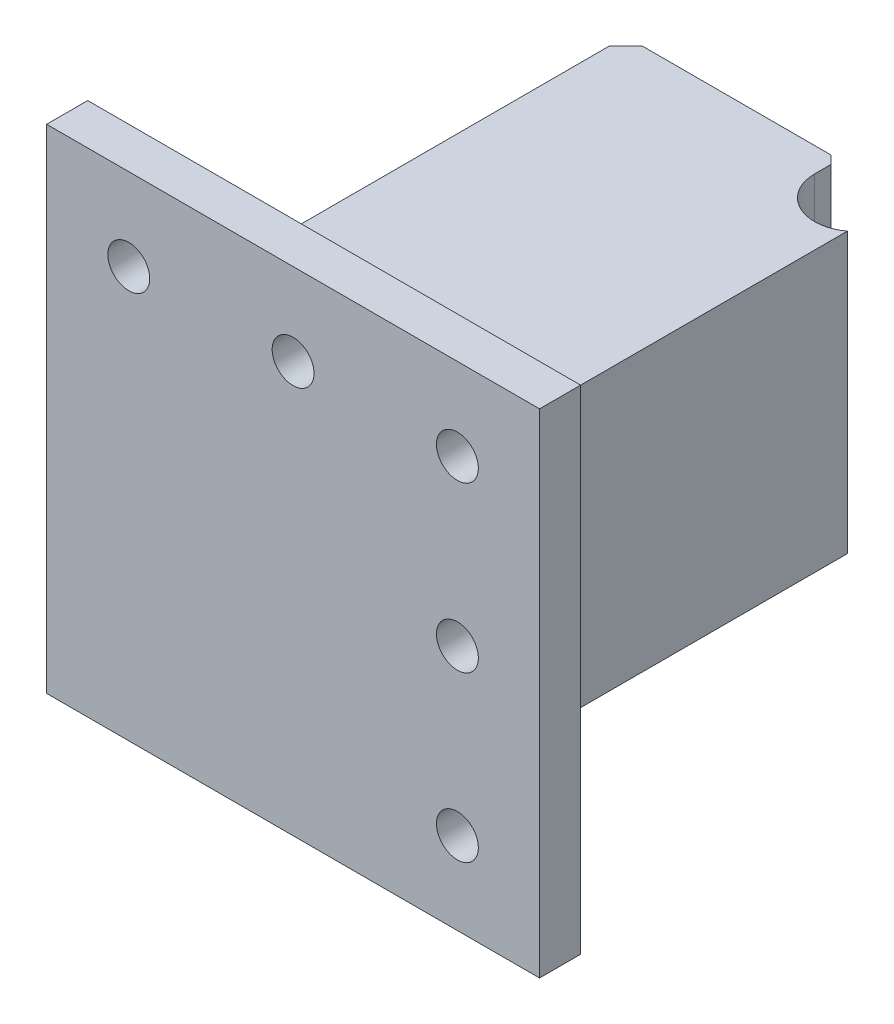
ISO-10303-21;
HEADER;
FILE_DESCRIPTION(('STEP AP214'),'2;1');
FILE_NAME('part.step','',(''),(''),'','','');
FILE_SCHEMA(('AUTOMOTIVE_DESIGN { 1 0 10303 214 1 1 1 1 }'));
ENDSEC;
DATA;
#1=APPLICATION_CONTEXT('core data for automotive mechanical design processes');
#2=APPLICATION_PROTOCOL_DEFINITION('international standard','automotive_design',2000,#1);
#3=PRODUCT_CONTEXT('',#1,'mechanical');
#4=PRODUCT('Part','Part','',(#3));
#5=PRODUCT_RELATED_PRODUCT_CATEGORY('part','',(#4));
#6=PRODUCT_DEFINITION_FORMATION('','',#4);
#7=PRODUCT_DEFINITION_CONTEXT('part definition',#1,'design');
#8=PRODUCT_DEFINITION('design','',#6,#7);
#9=PRODUCT_DEFINITION_SHAPE('','',#8);
#10=(LENGTH_UNIT() NAMED_UNIT(*) SI_UNIT(.MILLI.,.METRE.));
#11=(NAMED_UNIT(*) PLANE_ANGLE_UNIT() SI_UNIT($,.RADIAN.));
#12=(NAMED_UNIT(*) SI_UNIT($,.STERADIAN.) SOLID_ANGLE_UNIT());
#13=UNCERTAINTY_MEASURE_WITH_UNIT(LENGTH_MEASURE(1.E-05),#10,'distance_accuracy_value','');
#14=(GEOMETRIC_REPRESENTATION_CONTEXT(3) GLOBAL_UNCERTAINTY_ASSIGNED_CONTEXT((#13)) GLOBAL_UNIT_ASSIGNED_CONTEXT((#10,
#11,#12)) REPRESENTATION_CONTEXT('',''));
#15=CARTESIAN_POINT('',(0.,0.,0.));
#16=DIRECTION('',(0.,0.,1.));
#17=DIRECTION('',(1.,0.,0.));
#18=AXIS2_PLACEMENT_3D('',#15,#16,#17);
#19=CARTESIAN_POINT('',(0.,0.,5.));
#20=DIRECTION('',(0.,1.,0.));
#21=DIRECTION('',(0.,0.,1.));
#22=AXIS2_PLACEMENT_3D('',#19,#20,#21);
#23=PLANE('',#22);
#24=DIRECTION('',(0.,0.,-1.));
#25=VECTOR('',#24,1.);
#26=CARTESIAN_POINT('',(-60.,0.,5.));
#27=LINE('',#26,#25);
#28=CARTESIAN_POINT('',(-60.,0.,5.));
#29=VERTEX_POINT('',#28);
#30=CARTESIAN_POINT('',(-60.,0.,-63.5));
#31=VERTEX_POINT('',#30);
#32=EDGE_CURVE('E161',#29,#31,#27,.T.);
#33=ORIENTED_EDGE('',*,*,#32,.T.);
#34=DIRECTION('',(1.,0.,0.));
#35=VECTOR('',#34,1.);
#36=CARTESIAN_POINT('',(-34.0249999999993,0.,-63.5));
#37=LINE('',#36,#35);
#38=CARTESIAN_POINT('',(-34.0249999999993,0.,-63.5));
#39=VERTEX_POINT('',#38);
#40=EDGE_CURVE('E198',#31,#39,#37,.T.);
#41=ORIENTED_EDGE('',*,*,#40,.T.);
#42=DIRECTION('',(0.,0.,-1.));
#43=VECTOR('',#42,1.);
#44=CARTESIAN_POINT('',(-34.0249999999993,0.,0.));
#45=LINE('',#44,#43);
#46=CARTESIAN_POINT('',(-34.0249999999993,0.,-62.5000000000006));
#47=VERTEX_POINT('',#46);
#48=EDGE_CURVE('E136',#47,#39,#45,.T.);
#49=ORIENTED_EDGE('',*,*,#48,.F.);
#50=CARTESIAN_POINT('',(-28.9999999999993,0.,-62.5000000000006));
#51=DIRECTION('',(0.,-1.,0.));
#52=DIRECTION('',(0.,0.,-1.));
#53=AXIS2_PLACEMENT_3D('',#50,#51,#52);
#54=CIRCLE('',#53,5.025);
#55=CARTESIAN_POINT('',(-26.,0.,-58.4687936048871));
#56=VERTEX_POINT('',#55);
#57=EDGE_CURVE('E219',#56,#47,#54,.T.);
#58=ORIENTED_EDGE('',*,*,#57,.F.);
#59=DIRECTION('',(0.,0.,1.));
#60=VECTOR('',#59,1.);
#61=CARTESIAN_POINT('',(-26.,0.,-65.5));
#62=LINE('',#61,#60);
#63=CARTESIAN_POINT('',(-26.,0.,0.));
#64=VERTEX_POINT('',#63);
#65=EDGE_CURVE('E135',#56,#64,#62,.T.);
#66=ORIENTED_EDGE('',*,*,#65,.T.);
#67=DIRECTION('',(1.,0.,0.));
#68=VECTOR('',#67,1.);
#69=CARTESIAN_POINT('',(0.,0.,0.));
#70=LINE('',#69,#68);
#71=CARTESIAN_POINT('',(0.,0.,0.));
#72=VERTEX_POINT('',#71);
#73=EDGE_CURVE('E143',#64,#72,#70,.T.);
#74=ORIENTED_EDGE('',*,*,#73,.T.);
#75=DIRECTION('',(0.,0.,-1.));
#76=VECTOR('',#75,1.);
#77=CARTESIAN_POINT('',(0.,0.,5.));
#78=LINE('',#77,#76);
#79=CARTESIAN_POINT('',(0.,0.,5.));
#80=VERTEX_POINT('',#79);
#81=EDGE_CURVE('E169',#80,#72,#78,.T.);
#82=ORIENTED_EDGE('',*,*,#81,.F.);
#83=DIRECTION('',(1.,0.,0.));
#84=VECTOR('',#83,1.);
#85=CARTESIAN_POINT('',(0.,0.,5.));
#86=LINE('',#85,#84);
#87=EDGE_CURVE('E151',#29,#80,#86,.T.);
#88=ORIENTED_EDGE('',*,*,#87,.F.);
#89=EDGE_LOOP('',(#33,#41,#49,#58,#66,#74,#82,#88));
#90=FACE_BOUND('',#89,.T.);
#91=ADVANCED_FACE('F33',(#90),#23,.F.);
#92=CARTESIAN_POINT('',(0.,60.,5.));
#93=DIRECTION('',(-1.,0.,0.));
#94=DIRECTION('',(0.,0.,1.));
#95=AXIS2_PLACEMENT_3D('',#92,#93,#94);
#96=PLANE('',#95);
#97=DIRECTION('',(0.,1.,0.));
#98=VECTOR('',#97,1.);
#99=CARTESIAN_POINT('',(0.,60.,0.));
#100=LINE('',#99,#98);
#101=CARTESIAN_POINT('',(0.,60.,0.));
#102=VERTEX_POINT('',#101);
#103=EDGE_CURVE('E164',#72,#102,#100,.T.);
#104=ORIENTED_EDGE('',*,*,#103,.T.);
#105=DIRECTION('',(0.,0.,-1.));
#106=VECTOR('',#105,1.);
#107=CARTESIAN_POINT('',(0.,60.,5.));
#108=LINE('',#107,#106);
#109=CARTESIAN_POINT('',(0.,60.,5.));
#110=VERTEX_POINT('',#109);
#111=EDGE_CURVE('E182',#110,#102,#108,.T.);
#112=ORIENTED_EDGE('',*,*,#111,.F.);
#113=DIRECTION('',(0.,1.,0.));
#114=VECTOR('',#113,1.);
#115=CARTESIAN_POINT('',(0.,60.,5.));
#116=LINE('',#115,#114);
#117=EDGE_CURVE('E154',#80,#110,#116,.T.);
#118=ORIENTED_EDGE('',*,*,#117,.F.);
#119=ORIENTED_EDGE('',*,*,#81,.T.);
#120=EDGE_LOOP('',(#104,#112,#118,#119));
#121=FACE_BOUND('',#120,.T.);
#122=ADVANCED_FACE('F310',(#121),#96,.F.);
#123=CARTESIAN_POINT('',(0.,60.,5.));
#124=DIRECTION('',(0.,-1.,0.));
#125=DIRECTION('',(0.,0.,-1.));
#126=AXIS2_PLACEMENT_3D('',#123,#124,#125);
#127=PLANE('',#126);
#128=DIRECTION('',(-1.,0.,0.));
#129=VECTOR('',#128,1.);
#130=CARTESIAN_POINT('',(0.,60.,0.));
#131=LINE('',#130,#129);
#132=CARTESIAN_POINT('',(-60.,60.,0.));
#133=VERTEX_POINT('',#132);
#134=EDGE_CURVE('E174',#102,#133,#131,.T.);
#135=ORIENTED_EDGE('',*,*,#134,.T.);
#136=DIRECTION('',(0.,0.,-1.));
#137=VECTOR('',#136,1.);
#138=CARTESIAN_POINT('',(-60.,60.,5.));
#139=LINE('',#138,#137);
#140=CARTESIAN_POINT('',(-60.,60.,5.));
#141=VERTEX_POINT('',#140);
#142=EDGE_CURVE('E180',#141,#133,#139,.T.);
#143=ORIENTED_EDGE('',*,*,#142,.F.);
#144=DIRECTION('',(-1.,0.,0.));
#145=VECTOR('',#144,1.);
#146=CARTESIAN_POINT('',(0.,60.,5.));
#147=LINE('',#146,#145);
#148=EDGE_CURVE('E157',#110,#141,#147,.T.);
#149=ORIENTED_EDGE('',*,*,#148,.F.);
#150=ORIENTED_EDGE('',*,*,#111,.T.);
#151=EDGE_LOOP('',(#135,#143,#149,#150));
#152=FACE_BOUND('',#151,.T.);
#153=ADVANCED_FACE('F280',(#152),#127,.F.);
#154=CARTESIAN_POINT('',(-60.,0.,5.));
#155=DIRECTION('',(1.,0.,0.));
#156=DIRECTION('',(0.,0.,-1.));
#157=AXIS2_PLACEMENT_3D('',#154,#155,#156);
#158=PLANE('',#157);
#159=DIRECTION('',(0.,0.,1.));
#160=VECTOR('',#159,1.);
#161=CARTESIAN_POINT('',(-60.,34.,-65.5));
#162=LINE('',#161,#160);
#163=CARTESIAN_POINT('',(-60.,34.,-63.5));
#164=VERTEX_POINT('',#163);
#165=CARTESIAN_POINT('',(-60.,34.,0.));
#166=VERTEX_POINT('',#165);
#167=EDGE_CURVE('E141',#164,#166,#162,.T.);
#168=ORIENTED_EDGE('',*,*,#167,.F.);
#169=DIRECTION('',(0.,-1.,0.));
#170=VECTOR('',#169,1.);
#171=CARTESIAN_POINT('',(-60.,0.,-63.5));
#172=LINE('',#171,#170);
#173=EDGE_CURVE('E284',#164,#31,#172,.T.);
#174=ORIENTED_EDGE('',*,*,#173,.T.);
#175=ORIENTED_EDGE('',*,*,#32,.F.);
#176=DIRECTION('',(0.,-1.,0.));
#177=VECTOR('',#176,1.);
#178=CARTESIAN_POINT('',(-60.,0.,5.));
#179=LINE('',#178,#177);
#180=EDGE_CURVE('E159',#141,#29,#179,.T.);
#181=ORIENTED_EDGE('',*,*,#180,.F.);
#182=ORIENTED_EDGE('',*,*,#142,.T.);
#183=DIRECTION('',(0.,-1.,0.));
#184=VECTOR('',#183,1.);
#185=CARTESIAN_POINT('',(-60.,0.,0.));
#186=LINE('',#185,#184);
#187=EDGE_CURVE('E155',#133,#166,#186,.T.);
#188=ORIENTED_EDGE('',*,*,#187,.T.);
#189=EDGE_LOOP('',(#168,#174,#175,#181,#182,#188));
#190=FACE_BOUND('',#189,.T.);
#191=ADVANCED_FACE('F261',(#190),#158,.F.);
#192=CARTESIAN_POINT('',(0.,0.,5.));
#193=DIRECTION('',(0.,0.,-1.));
#194=DIRECTION('',(-1.,0.,0.));
#195=AXIS2_PLACEMENT_3D('',#192,#193,#194);
#196=PLANE('',#195);
#197=CARTESIAN_POINT('',(-9.99999999999999,9.99999999999995,5.));
#198=DIRECTION('',(0.,0.,1.));
#199=DIRECTION('',(1.,0.,0.));
#200=AXIS2_PLACEMENT_3D('',#197,#198,#199);
#201=CIRCLE('',#200,2.55000000000001);
#202=CARTESIAN_POINT('',(-7.44999999999998,9.99999999999995,5.));
#203=VERTEX_POINT('',#202);
#204=EDGE_CURVE('E246',#203,#203,#201,.T.);
#205=ORIENTED_EDGE('',*,*,#204,.F.);
#206=EDGE_LOOP('',(#205));
#207=FACE_BOUND('',#206,.T.);
#208=CARTESIAN_POINT('',(-10.,30.,5.));
#209=DIRECTION('',(0.,0.,1.));
#210=DIRECTION('',(1.,0.,0.));
#211=AXIS2_PLACEMENT_3D('',#208,#209,#210);
#212=CIRCLE('',#211,2.55000000000001);
#213=CARTESIAN_POINT('',(-7.44999999999998,30.,5.));
#214=VERTEX_POINT('',#213);
#215=EDGE_CURVE('E240',#214,#214,#212,.T.);
#216=ORIENTED_EDGE('',*,*,#215,.F.);
#217=EDGE_LOOP('',(#216));
#218=FACE_BOUND('',#217,.T.);
#219=CARTESIAN_POINT('',(-50.,50.,5.));
#220=DIRECTION('',(0.,0.,1.));
#221=DIRECTION('',(1.,0.,0.));
#222=AXIS2_PLACEMENT_3D('',#219,#220,#221);
#223=CIRCLE('',#222,2.55000000000001);
#224=CARTESIAN_POINT('',(-47.45,50.,5.));
#225=VERTEX_POINT('',#224);
#226=EDGE_CURVE('E234',#225,#225,#223,.T.);
#227=ORIENTED_EDGE('',*,*,#226,.F.);
#228=EDGE_LOOP('',(#227));
#229=FACE_BOUND('',#228,.T.);
#230=CARTESIAN_POINT('',(-30.,50.,5.));
#231=DIRECTION('',(0.,0.,1.));
#232=DIRECTION('',(1.,0.,0.));
#233=AXIS2_PLACEMENT_3D('',#230,#231,#232);
#234=CIRCLE('',#233,2.55000000000001);
#235=CARTESIAN_POINT('',(-27.45,50.,5.));
#236=VERTEX_POINT('',#235);
#237=EDGE_CURVE('E228',#236,#236,#234,.T.);
#238=ORIENTED_EDGE('',*,*,#237,.F.);
#239=EDGE_LOOP('',(#238));
#240=FACE_BOUND('',#239,.T.);
#241=CARTESIAN_POINT('',(-10.,50.,5.));
#242=DIRECTION('',(0.,0.,1.));
#243=DIRECTION('',(1.,0.,0.));
#244=AXIS2_PLACEMENT_3D('',#241,#242,#243);
#245=CIRCLE('',#244,2.55000000000002);
#246=CARTESIAN_POINT('',(-7.44999999999998,50.,5.));
#247=VERTEX_POINT('',#246);
#248=EDGE_CURVE('E227',#247,#247,#245,.T.);
#249=ORIENTED_EDGE('',*,*,#248,.F.);
#250=EDGE_LOOP('',(#249));
#251=FACE_BOUND('',#250,.T.);
#252=ORIENTED_EDGE('',*,*,#87,.T.);
#253=ORIENTED_EDGE('',*,*,#117,.T.);
#254=ORIENTED_EDGE('',*,*,#148,.T.);
#255=ORIENTED_EDGE('',*,*,#180,.T.);
#256=EDGE_LOOP('',(#252,#253,#254,#255));
#257=FACE_BOUND('',#256,.T.);
#258=ADVANCED_FACE('F257',(#207,#218,#229,#240,#251,#257),#196,.F.);
#259=CARTESIAN_POINT('',(0.,0.,0.));
#260=DIRECTION('',(0.,0.,-1.));
#261=DIRECTION('',(-1.,0.,0.));
#262=AXIS2_PLACEMENT_3D('',#259,#260,#261);
#263=PLANE('',#262);
#264=CARTESIAN_POINT('',(-9.99999999999999,9.99999999999995,0.));
#265=DIRECTION('',(0.,0.,-1.));
#266=DIRECTION('',(-1.,0.,0.));
#267=AXIS2_PLACEMENT_3D('',#264,#265,#266);
#268=CIRCLE('',#267,2.55000000000001);
#269=CARTESIAN_POINT('',(-12.55,9.99999999999995,0.));
#270=VERTEX_POINT('',#269);
#271=EDGE_CURVE('E249',#270,#270,#268,.F.);
#272=ORIENTED_EDGE('',*,*,#271,.T.);
#273=EDGE_LOOP('',(#272));
#274=FACE_BOUND('',#273,.T.);
#275=CARTESIAN_POINT('',(-10.,30.,0.));
#276=DIRECTION('',(0.,0.,-1.));
#277=DIRECTION('',(-1.,0.,0.));
#278=AXIS2_PLACEMENT_3D('',#275,#276,#277);
#279=CIRCLE('',#278,2.55000000000001);
#280=CARTESIAN_POINT('',(-12.55,30.,0.));
#281=VERTEX_POINT('',#280);
#282=EDGE_CURVE('E243',#281,#281,#279,.F.);
#283=ORIENTED_EDGE('',*,*,#282,.T.);
#284=EDGE_LOOP('',(#283));
#285=FACE_BOUND('',#284,.T.);
#286=CARTESIAN_POINT('',(-50.,50.,0.));
#287=DIRECTION('',(0.,0.,-1.));
#288=DIRECTION('',(-1.,0.,0.));
#289=AXIS2_PLACEMENT_3D('',#286,#287,#288);
#290=CIRCLE('',#289,2.55000000000001);
#291=CARTESIAN_POINT('',(-52.55,50.,0.));
#292=VERTEX_POINT('',#291);
#293=EDGE_CURVE('E237',#292,#292,#290,.F.);
#294=ORIENTED_EDGE('',*,*,#293,.T.);
#295=EDGE_LOOP('',(#294));
#296=FACE_BOUND('',#295,.T.);
#297=CARTESIAN_POINT('',(-30.,50.,0.));
#298=DIRECTION('',(0.,0.,-1.));
#299=DIRECTION('',(-1.,0.,0.));
#300=AXIS2_PLACEMENT_3D('',#297,#298,#299);
#301=CIRCLE('',#300,2.55000000000001);
#302=CARTESIAN_POINT('',(-32.55,50.,0.));
#303=VERTEX_POINT('',#302);
#304=EDGE_CURVE('E231',#303,#303,#301,.F.);
#305=ORIENTED_EDGE('',*,*,#304,.T.);
#306=EDGE_LOOP('',(#305));
#307=FACE_BOUND('',#306,.T.);
#308=CARTESIAN_POINT('',(-10.,50.,0.));
#309=DIRECTION('',(0.,0.,-1.));
#310=DIRECTION('',(-1.,0.,0.));
#311=AXIS2_PLACEMENT_3D('',#308,#309,#310);
#312=CIRCLE('',#311,2.55000000000002);
#313=CARTESIAN_POINT('',(-12.55,50.,0.));
#314=VERTEX_POINT('',#313);
#315=EDGE_CURVE('E224',#314,#314,#312,.F.);
#316=ORIENTED_EDGE('',*,*,#315,.T.);
#317=EDGE_LOOP('',(#316));
#318=FACE_BOUND('',#317,.T.);
#319=DIRECTION('',(0.,-1.,0.));
#320=VECTOR('',#319,1.);
#321=CARTESIAN_POINT('',(-26.,0.,0.));
#322=LINE('',#321,#320);
#323=CARTESIAN_POINT('',(-26.,34.,0.));
#324=VERTEX_POINT('',#323);
#325=EDGE_CURVE('E211',#324,#64,#322,.T.);
#326=ORIENTED_EDGE('',*,*,#325,.F.);
#327=DIRECTION('',(1.,0.,0.));
#328=VECTOR('',#327,1.);
#329=CARTESIAN_POINT('',(-60.,34.,0.));
#330=LINE('',#329,#328);
#331=EDGE_CURVE('E127',#166,#324,#330,.T.);
#332=ORIENTED_EDGE('',*,*,#331,.F.);
#333=ORIENTED_EDGE('',*,*,#187,.F.);
#334=ORIENTED_EDGE('',*,*,#134,.F.);
#335=ORIENTED_EDGE('',*,*,#103,.F.);
#336=ORIENTED_EDGE('',*,*,#73,.F.);
#337=EDGE_LOOP('',(#326,#332,#333,#334,#335,#336));
#338=FACE_BOUND('',#337,.T.);
#339=ADVANCED_FACE('F260',(#274,#285,#296,#307,#318,#338),#263,.T.);
#340=CARTESIAN_POINT('',(-60.,34.,-65.5));
#341=DIRECTION('',(0.,-1.,0.));
#342=DIRECTION('',(0.,0.,-1.));
#343=AXIS2_PLACEMENT_3D('',#340,#341,#342);
#344=PLANE('',#343);
#345=DIRECTION('',(0.,0.,1.));
#346=VECTOR('',#345,1.);
#347=CARTESIAN_POINT('',(-34.0249999999993,34.,0.));
#348=LINE('',#347,#346);
#349=CARTESIAN_POINT('',(-34.0249999999993,34.,-64.5));
#350=VERTEX_POINT('',#349);
#351=CARTESIAN_POINT('',(-34.0249999999993,34.,-62.5000000000006));
#352=VERTEX_POINT('',#351);
#353=EDGE_CURVE('E221',#350,#352,#348,.T.);
#354=ORIENTED_EDGE('',*,*,#353,.F.);
#355=DIRECTION('',(-0.707106781186543,0.,-0.707106781186552));
#356=VECTOR('',#355,1.);
#357=CARTESIAN_POINT('',(-35.0249999999993,34.,-65.5));
#358=LINE('',#357,#356);
#359=CARTESIAN_POINT('',(-35.0249999999993,34.,-65.5));
#360=VERTEX_POINT('',#359);
#361=EDGE_CURVE('E11',#350,#360,#358,.T.);
#362=ORIENTED_EDGE('',*,*,#361,.T.);
#363=DIRECTION('',(1.,0.,0.));
#364=VECTOR('',#363,1.);
#365=CARTESIAN_POINT('',(-60.,34.,-65.5));
#366=LINE('',#365,#364);
#367=CARTESIAN_POINT('',(-58.,34.,-65.5));
#368=VERTEX_POINT('',#367);
#369=EDGE_CURVE('E145',#368,#360,#366,.T.);
#370=ORIENTED_EDGE('',*,*,#369,.F.);
#371=DIRECTION('',(-0.707106781186545,0.,0.70710678118655));
#372=VECTOR('',#371,1.);
#373=CARTESIAN_POINT('',(-58.,34.,-65.5));
#374=LINE('',#373,#372);
#375=EDGE_CURVE('E204',#368,#164,#374,.T.);
#376=ORIENTED_EDGE('',*,*,#375,.T.);
#377=ORIENTED_EDGE('',*,*,#167,.T.);
#378=ORIENTED_EDGE('',*,*,#331,.T.);
#379=DIRECTION('',(0.,0.,1.));
#380=VECTOR('',#379,1.);
#381=CARTESIAN_POINT('',(-26.,34.,-65.5));
#382=LINE('',#381,#380);
#383=CARTESIAN_POINT('',(-26.,34.,-58.4687936048871));
#384=VERTEX_POINT('',#383);
#385=EDGE_CURVE('E133',#384,#324,#382,.T.);
#386=ORIENTED_EDGE('',*,*,#385,.F.);
#387=CARTESIAN_POINT('',(-28.9999999999993,34.,-62.5000000000006));
#388=DIRECTION('',(0.,-1.,0.));
#389=DIRECTION('',(0.,0.,-1.));
#390=AXIS2_PLACEMENT_3D('',#387,#388,#389);
#391=CIRCLE('',#390,5.025);
#392=EDGE_CURVE('E118',#352,#384,#391,.F.);
#393=ORIENTED_EDGE('',*,*,#392,.F.);
#394=EDGE_LOOP('',(#354,#362,#370,#376,#377,#378,#386,#393));
#395=FACE_BOUND('',#394,.T.);
#396=ADVANCED_FACE('F139',(#395),#344,.F.);
#397=CARTESIAN_POINT('',(-26.,0.,-65.5));
#398=DIRECTION('',(-1.,0.,0.));
#399=DIRECTION('',(0.,0.,1.));
#400=AXIS2_PLACEMENT_3D('',#397,#398,#399);
#401=PLANE('',#400);
#402=ORIENTED_EDGE('',*,*,#65,.F.);
#403=DIRECTION('',(0.,-1.,0.));
#404=VECTOR('',#403,1.);
#405=CARTESIAN_POINT('',(-26.,60.001025,-58.4687936048871));
#406=LINE('',#405,#404);
#407=EDGE_CURVE('E122',#384,#56,#406,.T.);
#408=ORIENTED_EDGE('',*,*,#407,.F.);
#409=ORIENTED_EDGE('',*,*,#385,.T.);
#410=ORIENTED_EDGE('',*,*,#325,.T.);
#411=EDGE_LOOP('',(#402,#408,#409,#410));
#412=FACE_BOUND('',#411,.T.);
#413=ADVANCED_FACE('F131',(#412),#401,.F.);
#414=CARTESIAN_POINT('',(0.,0.,-65.5));
#415=DIRECTION('',(0.,0.,-1.));
#416=DIRECTION('',(-1.,0.,0.));
#417=AXIS2_PLACEMENT_3D('',#414,#415,#416);
#418=PLANE('',#417);
#419=ORIENTED_EDGE('',*,*,#369,.T.);
#420=DIRECTION('',(0.,-1.,0.));
#421=VECTOR('',#420,1.);
#422=CARTESIAN_POINT('',(-35.0249999999993,2.00000000000003,-65.5));
#423=LINE('',#422,#421);
#424=CARTESIAN_POINT('',(-35.0249999999993,2.00000000000001,-65.5));
#425=VERTEX_POINT('',#424);
#426=EDGE_CURVE('E295',#360,#425,#423,.T.);
#427=ORIENTED_EDGE('',*,*,#426,.T.);
#428=DIRECTION('',(-1.,0.,0.));
#429=VECTOR('',#428,1.);
#430=CARTESIAN_POINT('',(-60.,2.00000000000002,-65.5));
#431=LINE('',#430,#429);
#432=CARTESIAN_POINT('',(-58.,2.00000000000002,-65.5));
#433=VERTEX_POINT('',#432);
#434=EDGE_CURVE('E192',#425,#433,#431,.T.);
#435=ORIENTED_EDGE('',*,*,#434,.T.);
#436=DIRECTION('',(0.,1.,0.));
#437=VECTOR('',#436,1.);
#438=CARTESIAN_POINT('',(-58.,34.,-65.5));
#439=LINE('',#438,#437);
#440=EDGE_CURVE('E189',#433,#368,#439,.T.);
#441=ORIENTED_EDGE('',*,*,#440,.T.);
#442=EDGE_LOOP('',(#419,#427,#435,#441));
#443=FACE_BOUND('',#442,.T.);
#444=ADVANCED_FACE('F326',(#443),#418,.T.);
#445=CARTESIAN_POINT('',(-34.0249999999993,60.001025,0.));
#446=DIRECTION('',(-1.,0.,0.));
#447=DIRECTION('',(0.,0.,1.));
#448=AXIS2_PLACEMENT_3D('',#445,#446,#447);
#449=PLANE('',#448);
#450=DIRECTION('',(0.,0.707106781186545,-0.70710678118655));
#451=VECTOR('',#450,1.);
#452=CARTESIAN_POINT('',(-34.0249999999993,2.00000000000002,-65.5));
#453=LINE('',#452,#451);
#454=CARTESIAN_POINT('',(-34.0249999999993,1.00000000000001,-64.5));
#455=VERTEX_POINT('',#454);
#456=EDGE_CURVE('E203',#39,#455,#453,.T.);
#457=ORIENTED_EDGE('',*,*,#456,.T.);
#458=DIRECTION('',(0.,1.,0.));
#459=VECTOR('',#458,1.);
#460=CARTESIAN_POINT('',(-34.0249999999993,34.,-64.5));
#461=LINE('',#460,#459);
#462=EDGE_CURVE('E41',#455,#350,#461,.T.);
#463=ORIENTED_EDGE('',*,*,#462,.T.);
#464=ORIENTED_EDGE('',*,*,#353,.T.);
#465=DIRECTION('',(0.,-1.,0.));
#466=VECTOR('',#465,1.);
#467=CARTESIAN_POINT('',(-34.0249999999993,60.001025,-62.5000000000006));
#468=LINE('',#467,#466);
#469=EDGE_CURVE('E124',#352,#47,#468,.T.);
#470=ORIENTED_EDGE('',*,*,#469,.T.);
#471=ORIENTED_EDGE('',*,*,#48,.T.);
#472=EDGE_LOOP('',(#457,#463,#464,#470,#471));
#473=FACE_BOUND('',#472,.T.);
#474=ADVANCED_FACE('F321',(#473),#449,.F.);
#475=CARTESIAN_POINT('',(-28.9999999999993,60.001025,-62.5000000000006));
#476=DIRECTION('',(0.,-1.,0.));
#477=DIRECTION('',(0.,0.,-1.));
#478=AXIS2_PLACEMENT_3D('',#475,#476,#477);
#479=CYLINDRICAL_SURFACE('',#478,5.025);
#480=ORIENTED_EDGE('',*,*,#392,.T.);
#481=ORIENTED_EDGE('',*,*,#407,.T.);
#482=ORIENTED_EDGE('',*,*,#57,.T.);
#483=ORIENTED_EDGE('',*,*,#469,.F.);
#484=EDGE_LOOP('',(#480,#481,#482,#483));
#485=FACE_BOUND('',#484,.T.);
#486=ADVANCED_FACE('F120',(#485),#479,.F.);
#487=CARTESIAN_POINT('',(-58.,0.,-65.5));
#488=DIRECTION('',(-0.70710678118655,0.,-0.707106781186545));
#489=DIRECTION('',(0.,-1.,0.));
#490=AXIS2_PLACEMENT_3D('',#487,#488,#489);
#491=PLANE('',#490);
#492=ORIENTED_EDGE('',*,*,#375,.F.);
#493=ORIENTED_EDGE('',*,*,#440,.F.);
#494=DIRECTION('',(-0.577350269189624,-0.577350269189624,0.577350269189629));
#495=VECTOR('',#494,1.);
#496=CARTESIAN_POINT('',(-58.6666666666667,1.33333333333335,-64.8333333333333));
#497=LINE('',#496,#495);
#498=EDGE_CURVE('E223',#31,#433,#497,.F.);
#499=ORIENTED_EDGE('',*,*,#498,.F.);
#500=ORIENTED_EDGE('',*,*,#173,.F.);
#501=EDGE_LOOP('',(#492,#493,#499,#500));
#502=FACE_BOUND('',#501,.T.);
#503=ADVANCED_FACE('F292',(#502),#491,.T.);
#504=CARTESIAN_POINT('',(0.,2.00000000000002,-65.5));
#505=DIRECTION('',(0.,-0.70710678118655,-0.707106781186545));
#506=DIRECTION('',(1.,0.,0.));
#507=AXIS2_PLACEMENT_3D('',#504,#505,#506);
#508=PLANE('',#507);
#509=ORIENTED_EDGE('',*,*,#434,.F.);
#510=DIRECTION('',(0.577350269189622,-0.577350269189626,0.57735026918963));
#511=VECTOR('',#510,1.);
#512=CARTESIAN_POINT('',(-23.3499999999997,-9.67499999999968,-53.8250000000002));
#513=LINE('',#512,#511);
#514=EDGE_CURVE('E55',#425,#455,#513,.T.);
#515=ORIENTED_EDGE('',*,*,#514,.T.);
#516=ORIENTED_EDGE('',*,*,#456,.F.);
#517=ORIENTED_EDGE('',*,*,#40,.F.);
#518=ORIENTED_EDGE('',*,*,#498,.T.);
#519=EDGE_LOOP('',(#509,#515,#516,#517,#518));
#520=FACE_BOUND('',#519,.T.);
#521=ADVANCED_FACE('F289',(#520),#508,.T.);
#522=CARTESIAN_POINT('',(-35.0249999999993,0.,-65.5));
#523=DIRECTION('',(0.707106781186552,0.,-0.707106781186542));
#524=DIRECTION('',(0.,1.,0.));
#525=AXIS2_PLACEMENT_3D('',#522,#523,#524);
#526=PLANE('',#525);
#527=ORIENTED_EDGE('',*,*,#361,.F.);
#528=ORIENTED_EDGE('',*,*,#462,.F.);
#529=ORIENTED_EDGE('',*,*,#514,.F.);
#530=ORIENTED_EDGE('',*,*,#426,.F.);
#531=EDGE_LOOP('',(#527,#528,#529,#530));
#532=FACE_BOUND('',#531,.T.);
#533=ADVANCED_FACE('F35',(#532),#526,.T.);
#534=CARTESIAN_POINT('',(-10.,50.,-65.501));
#535=DIRECTION('',(0.,0.,1.));
#536=DIRECTION('',(1.,0.,0.));
#537=AXIS2_PLACEMENT_3D('',#534,#535,#536);
#538=CYLINDRICAL_SURFACE('',#537,2.55000000000002);
#539=ORIENTED_EDGE('',*,*,#315,.F.);
#540=EDGE_LOOP('',(#539));
#541=FACE_BOUND('',#540,.T.);
#542=ORIENTED_EDGE('',*,*,#248,.T.);
#543=EDGE_LOOP('',(#542));
#544=FACE_BOUND('',#543,.T.);
#545=ADVANCED_FACE('F300',(#541,#544),#538,.F.);
#546=CARTESIAN_POINT('',(-30.,50.,-65.501));
#547=DIRECTION('',(0.,0.,1.));
#548=DIRECTION('',(1.,0.,0.));
#549=AXIS2_PLACEMENT_3D('',#546,#547,#548);
#550=CYLINDRICAL_SURFACE('',#549,2.55000000000001);
#551=ORIENTED_EDGE('',*,*,#304,.F.);
#552=EDGE_LOOP('',(#551));
#553=FACE_BOUND('',#552,.T.);
#554=ORIENTED_EDGE('',*,*,#237,.T.);
#555=EDGE_LOOP('',(#554));
#556=FACE_BOUND('',#555,.T.);
#557=ADVANCED_FACE('F305',(#553,#556),#550,.F.);
#558=CARTESIAN_POINT('',(-50.,50.,-65.501));
#559=DIRECTION('',(0.,0.,1.));
#560=DIRECTION('',(1.,0.,0.));
#561=AXIS2_PLACEMENT_3D('',#558,#559,#560);
#562=CYLINDRICAL_SURFACE('',#561,2.55000000000001);
#563=ORIENTED_EDGE('',*,*,#293,.F.);
#564=EDGE_LOOP('',(#563));
#565=FACE_BOUND('',#564,.T.);
#566=ORIENTED_EDGE('',*,*,#226,.T.);
#567=EDGE_LOOP('',(#566));
#568=FACE_BOUND('',#567,.T.);
#569=ADVANCED_FACE('F399',(#565,#568),#562,.F.);
#570=CARTESIAN_POINT('',(-10.,30.,-65.501));
#571=DIRECTION('',(0.,0.,1.));
#572=DIRECTION('',(1.,0.,0.));
#573=AXIS2_PLACEMENT_3D('',#570,#571,#572);
#574=CYLINDRICAL_SURFACE('',#573,2.55000000000001);
#575=ORIENTED_EDGE('',*,*,#282,.F.);
#576=EDGE_LOOP('',(#575));
#577=FACE_BOUND('',#576,.T.);
#578=ORIENTED_EDGE('',*,*,#215,.T.);
#579=EDGE_LOOP('',(#578));
#580=FACE_BOUND('',#579,.T.);
#581=ADVANCED_FACE('F408',(#577,#580),#574,.F.);
#582=CARTESIAN_POINT('',(-9.99999999999999,9.99999999999995,-65.501));
#583=DIRECTION('',(0.,0.,1.));
#584=DIRECTION('',(1.,0.,0.));
#585=AXIS2_PLACEMENT_3D('',#582,#583,#584);
#586=CYLINDRICAL_SURFACE('',#585,2.55000000000001);
#587=ORIENTED_EDGE('',*,*,#271,.F.);
#588=EDGE_LOOP('',(#587));
#589=FACE_BOUND('',#588,.T.);
#590=ORIENTED_EDGE('',*,*,#204,.T.);
#591=EDGE_LOOP('',(#590));
#592=FACE_BOUND('',#591,.T.);
#593=ADVANCED_FACE('F255',(#589,#592),#586,.F.);
#594=CLOSED_SHELL('',(#91,#122,#153,#191,#258,#339,#396,#413,#444,#474,#486,#503,#521,#533,#545,
#557,#569,#581,#593));
#595=MANIFOLD_SOLID_BREP('B2',#594);
#596=ADVANCED_BREP_SHAPE_REPRESENTATION('',(#18,#595),#14);
#597=SHAPE_DEFINITION_REPRESENTATION(#9,#596);
ENDSEC;
END-ISO-10303-21;
